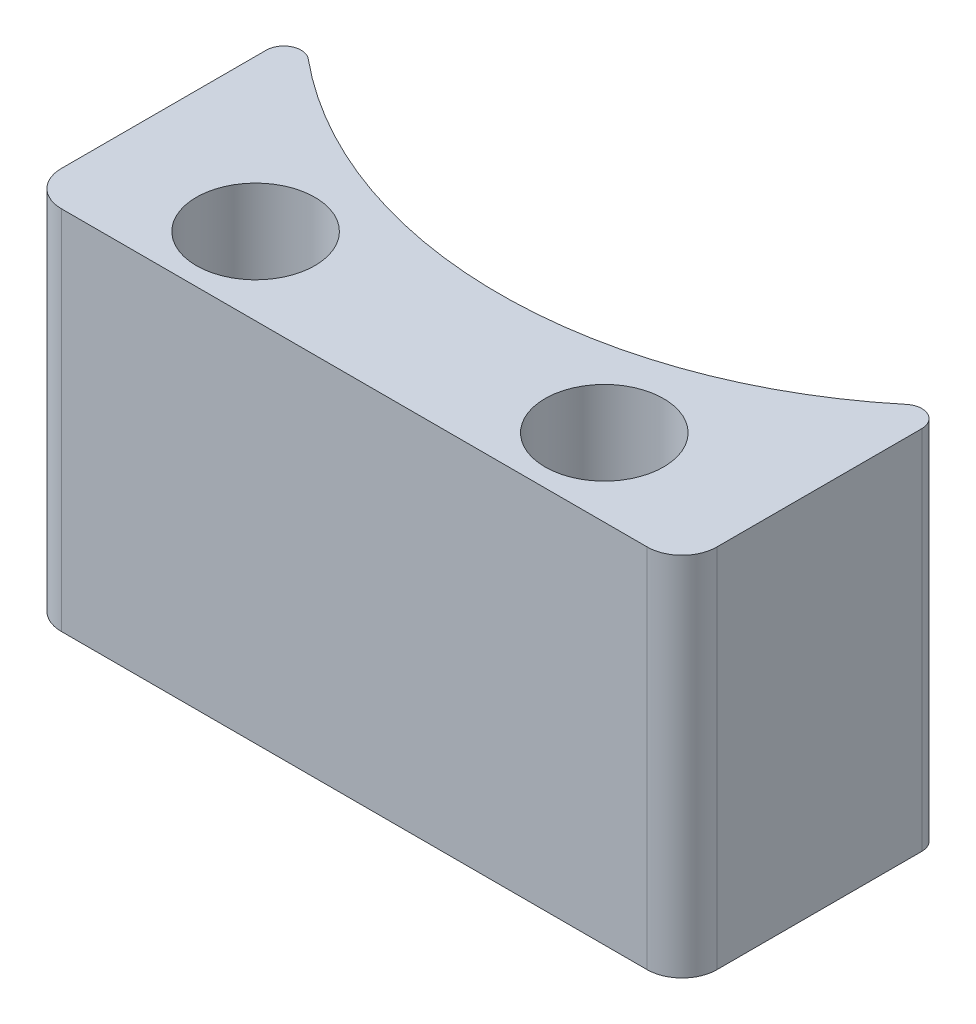
ISO-10303-21;
HEADER;
FILE_DESCRIPTION(('STEP AP214'),'2;1');
FILE_NAME('part.step','',(''),(''),'','','');
FILE_SCHEMA(('AUTOMOTIVE_DESIGN { 1 0 10303 214 1 1 1 1 }'));
ENDSEC;
DATA;
#1=APPLICATION_CONTEXT('core data for automotive mechanical design processes');
#2=APPLICATION_PROTOCOL_DEFINITION('international standard','automotive_design',2000,#1);
#3=PRODUCT_CONTEXT('',#1,'mechanical');
#4=PRODUCT('Part','Part','',(#3));
#5=PRODUCT_RELATED_PRODUCT_CATEGORY('part','',(#4));
#6=PRODUCT_DEFINITION_FORMATION('','',#4);
#7=PRODUCT_DEFINITION_CONTEXT('part definition',#1,'design');
#8=PRODUCT_DEFINITION('design','',#6,#7);
#9=PRODUCT_DEFINITION_SHAPE('','',#8);
#10=(LENGTH_UNIT() NAMED_UNIT(*) SI_UNIT(.MILLI.,.METRE.));
#11=(NAMED_UNIT(*) PLANE_ANGLE_UNIT() SI_UNIT($,.RADIAN.));
#12=(NAMED_UNIT(*) SI_UNIT($,.STERADIAN.) SOLID_ANGLE_UNIT());
#13=UNCERTAINTY_MEASURE_WITH_UNIT(LENGTH_MEASURE(1.E-05),#10,'distance_accuracy_value','');
#14=(GEOMETRIC_REPRESENTATION_CONTEXT(3) GLOBAL_UNCERTAINTY_ASSIGNED_CONTEXT((#13)) GLOBAL_UNIT_ASSIGNED_CONTEXT((#10,
#11,#12)) REPRESENTATION_CONTEXT('',''));
#15=CARTESIAN_POINT('',(0.,0.,0.));
#16=DIRECTION('',(0.,0.,1.));
#17=DIRECTION('',(1.,0.,0.));
#18=AXIS2_PLACEMENT_3D('',#15,#16,#17);
#19=CARTESIAN_POINT('',(9.4,10.5,-9.6));
#20=DIRECTION('',(0.,-1.,0.));
#21=DIRECTION('',(0.,0.,-1.));
#22=AXIS2_PLACEMENT_3D('',#19,#20,#21);
#23=CYLINDRICAL_SURFACE('',#22,13.4357731448547);
#24=CARTESIAN_POINT('',(9.4,10.5,-9.6));
#25=DIRECTION('',(0.,-1.,0.));
#26=DIRECTION('',(0.,0.,1.));
#27=AXIS2_PLACEMENT_3D('',#24,#25,#26);
#28=CIRCLE('',#27,13.4357731448547);
#29=CARTESIAN_POINT('',(17.9806779248094,10.5,0.738857110468652));
#30=VERTEX_POINT('',#29);
#31=CARTESIAN_POINT('',(0.81932207519057,10.5,0.738857110468647));
#32=VERTEX_POINT('',#31);
#33=EDGE_CURVE('E124',#30,#32,#28,.T.);
#34=ORIENTED_EDGE('',*,*,#33,.F.);
#35=DIRECTION('',(0.,-1.,0.));
#36=VECTOR('',#35,1.);
#37=CARTESIAN_POINT('',(17.9806779248094,10.5,0.738857110468652));
#38=LINE('',#37,#36);
#39=CARTESIAN_POINT('',(17.9806779248094,0.,0.738857110468652));
#40=VERTEX_POINT('',#39);
#41=EDGE_CURVE('E147',#30,#40,#38,.T.);
#42=ORIENTED_EDGE('',*,*,#41,.T.);
#43=CARTESIAN_POINT('',(9.4,0.,-9.6));
#44=DIRECTION('',(0.,-1.,0.));
#45=DIRECTION('',(0.,0.,1.));
#46=AXIS2_PLACEMENT_3D('',#43,#44,#45);
#47=CIRCLE('',#46,13.4357731448547);
#48=CARTESIAN_POINT('',(0.81932207519057,0.,0.738857110468647));
#49=VERTEX_POINT('',#48);
#50=EDGE_CURVE('E205',#40,#49,#47,.T.);
#51=ORIENTED_EDGE('',*,*,#50,.T.);
#52=DIRECTION('',(0.,-1.,0.));
#53=VECTOR('',#52,1.);
#54=CARTESIAN_POINT('',(0.819322075190573,10.5,0.738857110468647));
#55=LINE('',#54,#53);
#56=EDGE_CURVE('E145',#49,#32,#55,.F.);
#57=ORIENTED_EDGE('',*,*,#56,.T.);
#58=EDGE_LOOP('',(#34,#42,#51,#57));
#59=FACE_BOUND('',#58,.T.);
#60=ADVANCED_FACE('F36',(#59),#23,.F.);
#61=CARTESIAN_POINT('',(0.,10.5,0.));
#62=DIRECTION('',(1.,0.,0.));
#63=DIRECTION('',(0.,0.,-1.));
#64=AXIS2_PLACEMENT_3D('',#61,#62,#63);
#65=PLANE('',#64);
#66=DIRECTION('',(0.,0.,1.));
#67=VECTOR('',#66,1.);
#68=CARTESIAN_POINT('',(0.,10.5,0.));
#69=LINE('',#68,#67);
#70=CARTESIAN_POINT('',(0.,10.5,1.12360821481533));
#71=VERTEX_POINT('',#70);
#72=CARTESIAN_POINT('',(0.,10.5,7.));
#73=VERTEX_POINT('',#72);
#74=EDGE_CURVE('E127',#71,#73,#69,.T.);
#75=ORIENTED_EDGE('',*,*,#74,.F.);
#76=DIRECTION('',(0.,-1.,0.));
#77=VECTOR('',#76,1.);
#78=CARTESIAN_POINT('',(0.,10.5,1.12360821481533));
#79=LINE('',#78,#77);
#80=CARTESIAN_POINT('',(0.,0.,1.12360821481533));
#81=VERTEX_POINT('',#80);
#82=EDGE_CURVE('E11',#71,#81,#79,.T.);
#83=ORIENTED_EDGE('',*,*,#82,.T.);
#84=DIRECTION('',(0.,0.,1.));
#85=VECTOR('',#84,1.);
#86=CARTESIAN_POINT('',(0.,0.,0.));
#87=LINE('',#86,#85);
#88=CARTESIAN_POINT('',(0.,0.,7.));
#89=VERTEX_POINT('',#88);
#90=EDGE_CURVE('E129',#81,#89,#87,.T.);
#91=ORIENTED_EDGE('',*,*,#90,.T.);
#92=DIRECTION('',(0.,-1.,0.));
#93=VECTOR('',#92,1.);
#94=CARTESIAN_POINT('',(0.,10.5,7.));
#95=LINE('',#94,#93);
#96=EDGE_CURVE('E142',#89,#73,#95,.F.);
#97=ORIENTED_EDGE('',*,*,#96,.T.);
#98=EDGE_LOOP('',(#75,#83,#91,#97));
#99=FACE_BOUND('',#98,.T.);
#100=ADVANCED_FACE('F175',(#99),#65,.F.);
#101=CARTESIAN_POINT('',(0.,10.5,8.));
#102=DIRECTION('',(0.,0.,-1.));
#103=DIRECTION('',(-1.,0.,0.));
#104=AXIS2_PLACEMENT_3D('',#101,#102,#103);
#105=PLANE('',#104);
#106=DIRECTION('',(1.,0.,0.));
#107=VECTOR('',#106,1.);
#108=CARTESIAN_POINT('',(0.,0.,8.));
#109=LINE('',#108,#107);
#110=CARTESIAN_POINT('',(1.,0.,8.));
#111=VERTEX_POINT('',#110);
#112=CARTESIAN_POINT('',(17.8,0.,8.));
#113=VERTEX_POINT('',#112);
#114=EDGE_CURVE('E125',#111,#113,#109,.T.);
#115=ORIENTED_EDGE('',*,*,#114,.T.);
#116=DIRECTION('',(0.,-1.,0.));
#117=VECTOR('',#116,1.);
#118=CARTESIAN_POINT('',(17.8,10.5,8.));
#119=LINE('',#118,#117);
#120=CARTESIAN_POINT('',(17.8,10.5,8.));
#121=VERTEX_POINT('',#120);
#122=EDGE_CURVE('E109',#113,#121,#119,.F.);
#123=ORIENTED_EDGE('',*,*,#122,.T.);
#124=DIRECTION('',(1.,0.,0.));
#125=VECTOR('',#124,1.);
#126=CARTESIAN_POINT('',(0.,10.5,8.));
#127=LINE('',#126,#125);
#128=CARTESIAN_POINT('',(1.,10.5,8.));
#129=VERTEX_POINT('',#128);
#130=EDGE_CURVE('E199',#129,#121,#127,.T.);
#131=ORIENTED_EDGE('',*,*,#130,.F.);
#132=DIRECTION('',(0.,-1.,0.));
#133=VECTOR('',#132,1.);
#134=CARTESIAN_POINT('',(1.,10.5,8.));
#135=LINE('',#134,#133);
#136=EDGE_CURVE('E114',#129,#111,#135,.T.);
#137=ORIENTED_EDGE('',*,*,#136,.T.);
#138=EDGE_LOOP('',(#115,#123,#131,#137));
#139=FACE_BOUND('',#138,.T.);
#140=ADVANCED_FACE('F180',(#139),#105,.F.);
#141=CARTESIAN_POINT('',(18.8,10.5,0.));
#142=DIRECTION('',(-1.,0.,0.));
#143=DIRECTION('',(0.,0.,1.));
#144=AXIS2_PLACEMENT_3D('',#141,#142,#143);
#145=PLANE('',#144);
#146=DIRECTION('',(0.,0.,-1.));
#147=VECTOR('',#146,1.);
#148=CARTESIAN_POINT('',(18.8,0.,0.));
#149=LINE('',#148,#147);
#150=CARTESIAN_POINT('',(18.8,0.,7.));
#151=VERTEX_POINT('',#150);
#152=CARTESIAN_POINT('',(18.8,0.,1.12360821481533));
#153=VERTEX_POINT('',#152);
#154=EDGE_CURVE('E118',#151,#153,#149,.T.);
#155=ORIENTED_EDGE('',*,*,#154,.T.);
#156=DIRECTION('',(0.,-1.,0.));
#157=VECTOR('',#156,1.);
#158=CARTESIAN_POINT('',(18.8,10.5,1.12360821481533));
#159=LINE('',#158,#157);
#160=CARTESIAN_POINT('',(18.8,10.5,1.12360821481533));
#161=VERTEX_POINT('',#160);
#162=EDGE_CURVE('E59',#153,#161,#159,.F.);
#163=ORIENTED_EDGE('',*,*,#162,.T.);
#164=DIRECTION('',(0.,0.,-1.));
#165=VECTOR('',#164,1.);
#166=CARTESIAN_POINT('',(18.8,10.5,0.));
#167=LINE('',#166,#165);
#168=CARTESIAN_POINT('',(18.8,10.5,7.));
#169=VERTEX_POINT('',#168);
#170=EDGE_CURVE('E119',#169,#161,#167,.T.);
#171=ORIENTED_EDGE('',*,*,#170,.F.);
#172=DIRECTION('',(0.,-1.,0.));
#173=VECTOR('',#172,1.);
#174=CARTESIAN_POINT('',(18.8,10.5,7.));
#175=LINE('',#174,#173);
#176=EDGE_CURVE('E108',#169,#151,#175,.T.);
#177=ORIENTED_EDGE('',*,*,#176,.T.);
#178=EDGE_LOOP('',(#155,#163,#171,#177));
#179=FACE_BOUND('',#178,.T.);
#180=ADVANCED_FACE('F117',(#179),#145,.F.);
#181=CARTESIAN_POINT('',(9.4,10.5,-9.6));
#182=DIRECTION('',(0.,1.,0.));
#183=DIRECTION('',(0.,0.,1.));
#184=AXIS2_PLACEMENT_3D('',#181,#182,#183);
#185=PLANE('',#184);
#186=CARTESIAN_POINT('',(4.35024730125826,10.5,5.77922637132028));
#187=DIRECTION('',(0.,1.,0.));
#188=DIRECTION('',(0.,0.,1.));
#189=AXIS2_PLACEMENT_3D('',#186,#187,#188);
#190=CIRCLE('',#189,1.69999999999999);
#191=CARTESIAN_POINT('',(4.35024730125826,10.5,7.47922637132027));
#192=VERTEX_POINT('',#191);
#193=EDGE_CURVE('E220',#192,#192,#190,.T.);
#194=ORIENTED_EDGE('',*,*,#193,.F.);
#195=EDGE_LOOP('',(#194));
#196=FACE_BOUND('',#195,.T.);
#197=CARTESIAN_POINT('',(14.3502473012583,10.5,5.77922637132028));
#198=DIRECTION('',(0.,1.,0.));
#199=DIRECTION('',(0.,0.,1.));
#200=AXIS2_PLACEMENT_3D('',#197,#198,#199);
#201=CIRCLE('',#200,1.69999999999999);
#202=CARTESIAN_POINT('',(14.3502473012583,10.5,7.47922637132027));
#203=VERTEX_POINT('',#202);
#204=EDGE_CURVE('E210',#203,#203,#201,.T.);
#205=ORIENTED_EDGE('',*,*,#204,.F.);
#206=EDGE_LOOP('',(#205));
#207=FACE_BOUND('',#206,.T.);
#208=ORIENTED_EDGE('',*,*,#170,.T.);
#209=CARTESIAN_POINT('',(18.3,10.5,1.12360821481533));
#210=DIRECTION('',(0.,1.,0.));
#211=DIRECTION('',(0.,0.,1.));
#212=AXIS2_PLACEMENT_3D('',#209,#210,#211);
#213=CIRCLE('',#212,0.5);
#214=EDGE_CURVE('E44',#161,#30,#213,.T.);
#215=ORIENTED_EDGE('',*,*,#214,.T.);
#216=ORIENTED_EDGE('',*,*,#33,.T.);
#217=CARTESIAN_POINT('',(0.500000000000003,10.5,1.12360821481533));
#218=DIRECTION('',(0.,1.,0.));
#219=DIRECTION('',(0.,0.,1.));
#220=AXIS2_PLACEMENT_3D('',#217,#218,#219);
#221=CIRCLE('',#220,0.5);
#222=EDGE_CURVE('E51',#32,#71,#221,.T.);
#223=ORIENTED_EDGE('',*,*,#222,.T.);
#224=ORIENTED_EDGE('',*,*,#74,.T.);
#225=CARTESIAN_POINT('',(1.,10.5,7.));
#226=DIRECTION('',(0.,1.,0.));
#227=DIRECTION('',(0.,0.,1.));
#228=AXIS2_PLACEMENT_3D('',#225,#226,#227);
#229=CIRCLE('',#228,1.);
#230=EDGE_CURVE('E138',#73,#129,#229,.T.);
#231=ORIENTED_EDGE('',*,*,#230,.T.);
#232=ORIENTED_EDGE('',*,*,#130,.T.);
#233=CARTESIAN_POINT('',(17.8,10.5,7.));
#234=DIRECTION('',(0.,1.,0.));
#235=DIRECTION('',(0.,0.,1.));
#236=AXIS2_PLACEMENT_3D('',#233,#234,#235);
#237=CIRCLE('',#236,1.);
#238=EDGE_CURVE('E140',#121,#169,#237,.T.);
#239=ORIENTED_EDGE('',*,*,#238,.T.);
#240=EDGE_LOOP('',(#208,#215,#216,#223,#224,#231,#232,#239));
#241=FACE_BOUND('',#240,.T.);
#242=ADVANCED_FACE('F156',(#196,#207,#241),#185,.T.);
#243=CARTESIAN_POINT('',(9.4,0.,-9.6));
#244=DIRECTION('',(0.,1.,0.));
#245=DIRECTION('',(0.,0.,1.));
#246=AXIS2_PLACEMENT_3D('',#243,#244,#245);
#247=PLANE('',#246);
#248=CARTESIAN_POINT('',(4.35024730125826,0.,5.77922637132028));
#249=DIRECTION('',(0.,1.,0.));
#250=DIRECTION('',(0.,0.,1.));
#251=AXIS2_PLACEMENT_3D('',#248,#249,#250);
#252=CIRCLE('',#251,1.69999999999999);
#253=CARTESIAN_POINT('',(4.35024730125826,0.,7.47922637132027));
#254=VERTEX_POINT('',#253);
#255=EDGE_CURVE('E215',#254,#254,#252,.T.);
#256=ORIENTED_EDGE('',*,*,#255,.T.);
#257=EDGE_LOOP('',(#256));
#258=FACE_BOUND('',#257,.T.);
#259=CARTESIAN_POINT('',(14.3502473012583,0.,5.77922637132028));
#260=DIRECTION('',(0.,1.,0.));
#261=DIRECTION('',(0.,0.,1.));
#262=AXIS2_PLACEMENT_3D('',#259,#260,#261);
#263=CIRCLE('',#262,1.69999999999999);
#264=CARTESIAN_POINT('',(14.3502473012583,0.,7.47922637132027));
#265=VERTEX_POINT('',#264);
#266=EDGE_CURVE('E206',#265,#265,#263,.T.);
#267=ORIENTED_EDGE('',*,*,#266,.T.);
#268=EDGE_LOOP('',(#267));
#269=FACE_BOUND('',#268,.T.);
#270=ORIENTED_EDGE('',*,*,#50,.F.);
#271=CARTESIAN_POINT('',(18.3,0.,1.12360821481533));
#272=DIRECTION('',(0.,1.,0.));
#273=DIRECTION('',(0.,0.,1.));
#274=AXIS2_PLACEMENT_3D('',#271,#272,#273);
#275=CIRCLE('',#274,0.5);
#276=EDGE_CURVE('E123',#40,#153,#275,.F.);
#277=ORIENTED_EDGE('',*,*,#276,.T.);
#278=ORIENTED_EDGE('',*,*,#154,.F.);
#279=CARTESIAN_POINT('',(17.8,0.,7.));
#280=DIRECTION('',(0.,1.,0.));
#281=DIRECTION('',(0.,0.,1.));
#282=AXIS2_PLACEMENT_3D('',#279,#280,#281);
#283=CIRCLE('',#282,1.);
#284=EDGE_CURVE('E104',#151,#113,#283,.F.);
#285=ORIENTED_EDGE('',*,*,#284,.T.);
#286=ORIENTED_EDGE('',*,*,#114,.F.);
#287=CARTESIAN_POINT('',(1.,0.,7.));
#288=DIRECTION('',(0.,1.,0.));
#289=DIRECTION('',(0.,0.,1.));
#290=AXIS2_PLACEMENT_3D('',#287,#288,#289);
#291=CIRCLE('',#290,1.);
#292=EDGE_CURVE('E115',#111,#89,#291,.F.);
#293=ORIENTED_EDGE('',*,*,#292,.T.);
#294=ORIENTED_EDGE('',*,*,#90,.F.);
#295=CARTESIAN_POINT('',(0.500000000000003,0.,1.12360821481533));
#296=DIRECTION('',(0.,1.,0.));
#297=DIRECTION('',(0.,0.,1.));
#298=AXIS2_PLACEMENT_3D('',#295,#296,#297);
#299=CIRCLE('',#298,0.5);
#300=EDGE_CURVE('E150',#81,#49,#299,.F.);
#301=ORIENTED_EDGE('',*,*,#300,.T.);
#302=EDGE_LOOP('',(#270,#277,#278,#285,#286,#293,#294,#301));
#303=FACE_BOUND('',#302,.T.);
#304=ADVANCED_FACE('F122',(#258,#269,#303),#247,.F.);
#305=CARTESIAN_POINT('',(17.8,10.5,7.));
#306=DIRECTION('',(0.,-1.,0.));
#307=DIRECTION('',(0.,0.,-1.));
#308=AXIS2_PLACEMENT_3D('',#305,#306,#307);
#309=CYLINDRICAL_SURFACE('',#308,1.);
#310=ORIENTED_EDGE('',*,*,#238,.F.);
#311=ORIENTED_EDGE('',*,*,#122,.F.);
#312=ORIENTED_EDGE('',*,*,#284,.F.);
#313=ORIENTED_EDGE('',*,*,#176,.F.);
#314=EDGE_LOOP('',(#310,#311,#312,#313));
#315=FACE_BOUND('',#314,.T.);
#316=ADVANCED_FACE('F107',(#315),#309,.T.);
#317=CARTESIAN_POINT('',(1.,10.5,7.));
#318=DIRECTION('',(0.,-1.,0.));
#319=DIRECTION('',(0.,0.,-1.));
#320=AXIS2_PLACEMENT_3D('',#317,#318,#319);
#321=CYLINDRICAL_SURFACE('',#320,1.);
#322=ORIENTED_EDGE('',*,*,#230,.F.);
#323=ORIENTED_EDGE('',*,*,#96,.F.);
#324=ORIENTED_EDGE('',*,*,#292,.F.);
#325=ORIENTED_EDGE('',*,*,#136,.F.);
#326=EDGE_LOOP('',(#322,#323,#324,#325));
#327=FACE_BOUND('',#326,.T.);
#328=ADVANCED_FACE('F186',(#327),#321,.T.);
#329=CARTESIAN_POINT('',(14.3502473012583,10.5,5.77922637132028));
#330=DIRECTION('',(0.,1.,0.));
#331=DIRECTION('',(0.,0.,1.));
#332=AXIS2_PLACEMENT_3D('',#329,#330,#331);
#333=CYLINDRICAL_SURFACE('',#332,1.69999999999999);
#334=ORIENTED_EDGE('',*,*,#266,.F.);
#335=EDGE_LOOP('',(#334));
#336=FACE_BOUND('',#335,.T.);
#337=ORIENTED_EDGE('',*,*,#204,.T.);
#338=EDGE_LOOP('',(#337));
#339=FACE_BOUND('',#338,.T.);
#340=ADVANCED_FACE('F170',(#336,#339),#333,.F.);
#341=CARTESIAN_POINT('',(4.35024730125826,10.5,5.77922637132028));
#342=DIRECTION('',(0.,1.,0.));
#343=DIRECTION('',(0.,0.,1.));
#344=AXIS2_PLACEMENT_3D('',#341,#342,#343);
#345=CYLINDRICAL_SURFACE('',#344,1.69999999999999);
#346=ORIENTED_EDGE('',*,*,#255,.F.);
#347=EDGE_LOOP('',(#346));
#348=FACE_BOUND('',#347,.T.);
#349=ORIENTED_EDGE('',*,*,#193,.T.);
#350=EDGE_LOOP('',(#349));
#351=FACE_BOUND('',#350,.T.);
#352=ADVANCED_FACE('F164',(#348,#351),#345,.F.);
#353=CARTESIAN_POINT('',(18.3,10.5,1.12360821481533));
#354=DIRECTION('',(0.,-1.,0.));
#355=DIRECTION('',(0.,0.,-1.));
#356=AXIS2_PLACEMENT_3D('',#353,#354,#355);
#357=CYLINDRICAL_SURFACE('',#356,0.5);
#358=ORIENTED_EDGE('',*,*,#214,.F.);
#359=ORIENTED_EDGE('',*,*,#162,.F.);
#360=ORIENTED_EDGE('',*,*,#276,.F.);
#361=ORIENTED_EDGE('',*,*,#41,.F.);
#362=EDGE_LOOP('',(#358,#359,#360,#361));
#363=FACE_BOUND('',#362,.T.);
#364=ADVANCED_FACE('F162',(#363),#357,.T.);
#365=CARTESIAN_POINT('',(0.500000000000003,10.5,1.12360821481533));
#366=DIRECTION('',(0.,-1.,0.));
#367=DIRECTION('',(0.,0.,-1.));
#368=AXIS2_PLACEMENT_3D('',#365,#366,#367);
#369=CYLINDRICAL_SURFACE('',#368,0.5);
#370=ORIENTED_EDGE('',*,*,#222,.F.);
#371=ORIENTED_EDGE('',*,*,#56,.F.);
#372=ORIENTED_EDGE('',*,*,#300,.F.);
#373=ORIENTED_EDGE('',*,*,#82,.F.);
#374=EDGE_LOOP('',(#370,#371,#372,#373));
#375=FACE_BOUND('',#374,.T.);
#376=ADVANCED_FACE('F38',(#375),#369,.T.);
#377=CLOSED_SHELL('',(#60,#100,#140,#180,#242,#304,#316,#328,#340,#352,#364,#376));
#378=MANIFOLD_SOLID_BREP('B2',#377);
#379=ADVANCED_BREP_SHAPE_REPRESENTATION('',(#18,#378),#14);
#380=SHAPE_DEFINITION_REPRESENTATION(#9,#379);
ENDSEC;
END-ISO-10303-21;
